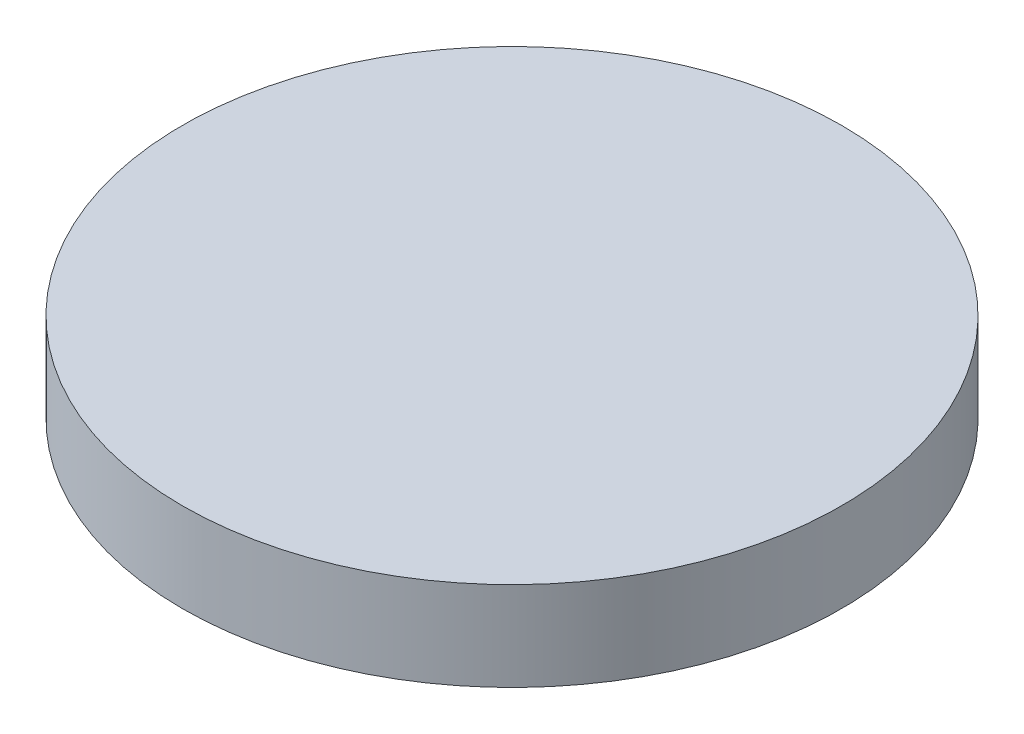
ISO-10303-21;
HEADER;
FILE_DESCRIPTION(('STEP AP214'),'2;1');
FILE_NAME('part.step','',(''),(''),'','','');
FILE_SCHEMA(('AUTOMOTIVE_DESIGN { 1 0 10303 214 1 1 1 1 }'));
ENDSEC;
DATA;
#1=APPLICATION_CONTEXT('core data for automotive mechanical design processes');
#2=APPLICATION_PROTOCOL_DEFINITION('international standard','automotive_design',2000,#1);
#3=PRODUCT_CONTEXT('',#1,'mechanical');
#4=PRODUCT('Part','Part','',(#3));
#5=PRODUCT_RELATED_PRODUCT_CATEGORY('part','',(#4));
#6=PRODUCT_DEFINITION_FORMATION('','',#4);
#7=PRODUCT_DEFINITION_CONTEXT('part definition',#1,'design');
#8=PRODUCT_DEFINITION('design','',#6,#7);
#9=PRODUCT_DEFINITION_SHAPE('','',#8);
#10=(LENGTH_UNIT() NAMED_UNIT(*) SI_UNIT(.MILLI.,.METRE.));
#11=(NAMED_UNIT(*) PLANE_ANGLE_UNIT() SI_UNIT($,.RADIAN.));
#12=(NAMED_UNIT(*) SI_UNIT($,.STERADIAN.) SOLID_ANGLE_UNIT());
#13=UNCERTAINTY_MEASURE_WITH_UNIT(LENGTH_MEASURE(1.E-05),#10,'distance_accuracy_value','');
#14=(GEOMETRIC_REPRESENTATION_CONTEXT(3) GLOBAL_UNCERTAINTY_ASSIGNED_CONTEXT((#13)) GLOBAL_UNIT_ASSIGNED_CONTEXT((#10,
#11,#12)) REPRESENTATION_CONTEXT('',''));
#15=CARTESIAN_POINT('',(0.,0.,0.));
#16=DIRECTION('',(0.,0.,1.));
#17=DIRECTION('',(1.,0.,0.));
#18=AXIS2_PLACEMENT_3D('',#15,#16,#17);
#19=CARTESIAN_POINT('',(0.,1.,0.));
#20=DIRECTION('',(0.,-1.,0.));
#21=DIRECTION('',(0.,0.,-1.));
#22=AXIS2_PLACEMENT_3D('',#19,#20,#21);
#23=CYLINDRICAL_SURFACE('',#22,3.7);
#24=CARTESIAN_POINT('',(0.,1.,0.));
#25=DIRECTION('',(0.,1.,0.));
#26=DIRECTION('',(0.,0.,1.));
#27=AXIS2_PLACEMENT_3D('',#24,#25,#26);
#28=CIRCLE('',#27,3.7);
#29=CARTESIAN_POINT('',(0.,1.,3.7));
#30=VERTEX_POINT('',#29);
#31=EDGE_CURVE('E10',#30,#30,#28,.T.);
#32=ORIENTED_EDGE('',*,*,#31,.F.);
#33=EDGE_LOOP('',(#32));
#34=FACE_BOUND('',#33,.T.);
#35=CARTESIAN_POINT('',(0.,0.,0.));
#36=DIRECTION('',(0.,1.,0.));
#37=DIRECTION('',(0.,0.,1.));
#38=AXIS2_PLACEMENT_3D('',#35,#36,#37);
#39=CIRCLE('',#38,3.7);
#40=CARTESIAN_POINT('',(0.,0.,3.7));
#41=VERTEX_POINT('',#40);
#42=EDGE_CURVE('E40',#41,#41,#39,.T.);
#43=ORIENTED_EDGE('',*,*,#42,.T.);
#44=EDGE_LOOP('',(#43));
#45=FACE_BOUND('',#44,.T.);
#46=ADVANCED_FACE('F37',(#34,#45),#23,.T.);
#47=CARTESIAN_POINT('',(0.,1.,0.));
#48=DIRECTION('',(0.,1.,0.));
#49=DIRECTION('',(0.,0.,1.));
#50=AXIS2_PLACEMENT_3D('',#47,#48,#49);
#51=PLANE('',#50);
#52=ORIENTED_EDGE('',*,*,#31,.T.);
#53=EDGE_LOOP('',(#52));
#54=FACE_BOUND('',#53,.T.);
#55=ADVANCED_FACE('F54',(#54),#51,.T.);
#56=CARTESIAN_POINT('',(0.,0.,0.));
#57=DIRECTION('',(0.,1.,0.));
#58=DIRECTION('',(0.,0.,1.));
#59=AXIS2_PLACEMENT_3D('',#56,#57,#58);
#60=PLANE('',#59);
#61=ORIENTED_EDGE('',*,*,#42,.F.);
#62=EDGE_LOOP('',(#61));
#63=FACE_BOUND('',#62,.T.);
#64=ADVANCED_FACE('F52',(#63),#60,.F.);
#65=CLOSED_SHELL('',(#46,#55,#64));
#66=MANIFOLD_SOLID_BREP('B2',#65);
#67=ADVANCED_BREP_SHAPE_REPRESENTATION('',(#18,#66),#14);
#68=SHAPE_DEFINITION_REPRESENTATION(#9,#67);
ENDSEC;
END-ISO-10303-21;
